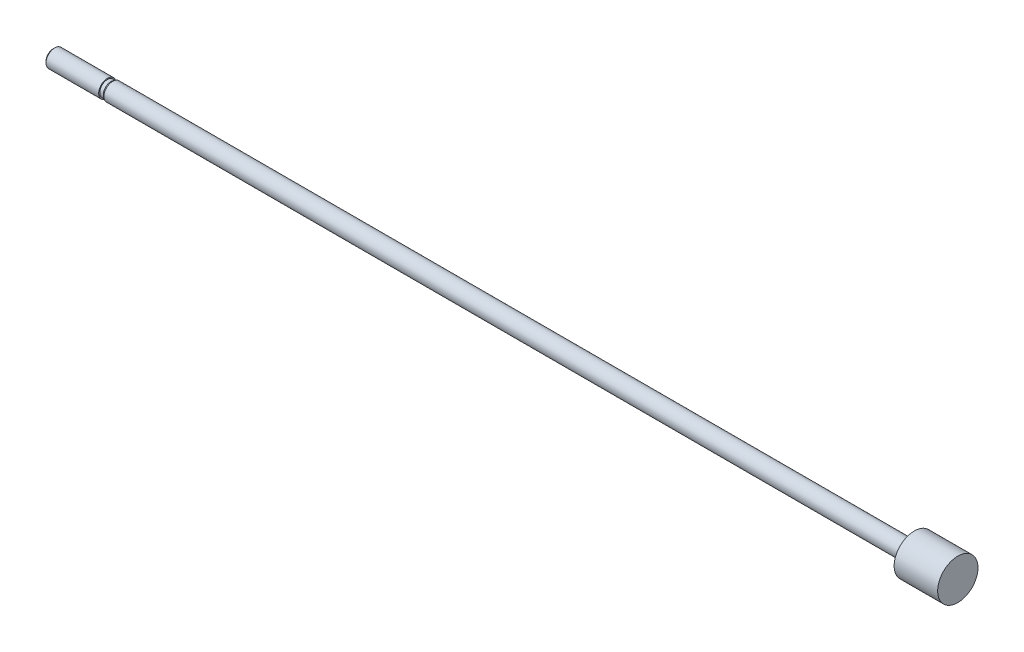
ISO-10303-21;
HEADER;
FILE_DESCRIPTION(('STEP AP214'),'2;1');
FILE_NAME('part.step','',(''),(''),'','','');
FILE_SCHEMA(('AUTOMOTIVE_DESIGN { 1 0 10303 214 1 1 1 1 }'));
ENDSEC;
DATA;
#1=APPLICATION_CONTEXT('core data for automotive mechanical design processes');
#2=APPLICATION_PROTOCOL_DEFINITION('international standard','automotive_design',2000,#1);
#3=PRODUCT_CONTEXT('',#1,'mechanical');
#4=PRODUCT('Part','Part','',(#3));
#5=PRODUCT_RELATED_PRODUCT_CATEGORY('part','',(#4));
#6=PRODUCT_DEFINITION_FORMATION('','',#4);
#7=PRODUCT_DEFINITION_CONTEXT('part definition',#1,'design');
#8=PRODUCT_DEFINITION('design','',#6,#7);
#9=PRODUCT_DEFINITION_SHAPE('','',#8);
#10=(LENGTH_UNIT() NAMED_UNIT(*) SI_UNIT(.MILLI.,.METRE.));
#11=(NAMED_UNIT(*) PLANE_ANGLE_UNIT() SI_UNIT($,.RADIAN.));
#12=(NAMED_UNIT(*) SI_UNIT($,.STERADIAN.) SOLID_ANGLE_UNIT());
#13=UNCERTAINTY_MEASURE_WITH_UNIT(LENGTH_MEASURE(1.E-05),#10,'distance_accuracy_value','');
#14=(GEOMETRIC_REPRESENTATION_CONTEXT(3) GLOBAL_UNCERTAINTY_ASSIGNED_CONTEXT((#13)) GLOBAL_UNIT_ASSIGNED_CONTEXT((#10,
#11,#12)) REPRESENTATION_CONTEXT('',''));
#15=CARTESIAN_POINT('',(0.,0.,0.));
#16=DIRECTION('',(0.,0.,1.));
#17=DIRECTION('',(1.,0.,0.));
#18=AXIS2_PLACEMENT_3D('',#15,#16,#17);
#19=CARTESIAN_POINT('',(0.,0.,0.));
#20=DIRECTION('',(1.,0.,0.));
#21=DIRECTION('',(0.,0.,-1.));
#22=AXIS2_PLACEMENT_3D('',#19,#20,#21);
#23=PLANE('',#22);
#24=CARTESIAN_POINT('',(0.,0.,0.));
#25=DIRECTION('',(1.,0.,0.));
#26=DIRECTION('',(0.,0.,-1.));
#27=AXIS2_PLACEMENT_3D('',#24,#25,#26);
#28=CIRCLE('',#27,2.0095);
#29=CARTESIAN_POINT('',(0.,0.,-2.0095));
#30=VERTEX_POINT('',#29);
#31=EDGE_CURVE('E47',#30,#30,#28,.T.);
#32=ORIENTED_EDGE('',*,*,#31,.F.);
#33=EDGE_LOOP('',(#32));
#34=FACE_BOUND('',#33,.T.);
#35=ADVANCED_FACE('F15',(#34),#23,.F.);
#36=CARTESIAN_POINT('',(0.,0.,0.));
#37=DIRECTION('',(1.,0.,0.));
#38=DIRECTION('',(0.,0.,-1.));
#39=AXIS2_PLACEMENT_3D('',#36,#37,#38);
#40=CONICAL_SURFACE('',#39,2.0095,0.785398163397443);
#41=CARTESIAN_POINT('',(0.490499999999997,0.,0.));
#42=DIRECTION('',(1.,0.,0.));
#43=DIRECTION('',(0.,0.,-1.));
#44=AXIS2_PLACEMENT_3D('',#41,#42,#43);
#45=CIRCLE('',#44,2.5);
#46=CARTESIAN_POINT('',(0.490499999999997,0.,-2.5));
#47=VERTEX_POINT('',#46);
#48=EDGE_CURVE('E44',#47,#47,#45,.T.);
#49=ORIENTED_EDGE('',*,*,#48,.F.);
#50=EDGE_LOOP('',(#49));
#51=FACE_BOUND('',#50,.T.);
#52=ORIENTED_EDGE('',*,*,#31,.T.);
#53=EDGE_LOOP('',(#52));
#54=FACE_BOUND('',#53,.T.);
#55=ADVANCED_FACE('F51',(#51,#54),#40,.T.);
#56=CARTESIAN_POINT('',(257.85,0.,0.));
#57=DIRECTION('',(1.,0.,0.));
#58=DIRECTION('',(0.,0.,-1.));
#59=AXIS2_PLACEMENT_3D('',#56,#57,#58);
#60=CYLINDRICAL_SURFACE('',#59,2.5);
#61=CARTESIAN_POINT('',(15.5,0.,0.));
#62=DIRECTION('',(1.,0.,0.));
#63=DIRECTION('',(0.,0.,-1.));
#64=AXIS2_PLACEMENT_3D('',#61,#62,#63);
#65=CIRCLE('',#64,2.5);
#66=CARTESIAN_POINT('',(15.5,0.,-2.5));
#67=VERTEX_POINT('',#66);
#68=EDGE_CURVE('E41',#67,#67,#65,.T.);
#69=ORIENTED_EDGE('',*,*,#68,.F.);
#70=EDGE_LOOP('',(#69));
#71=FACE_BOUND('',#70,.T.);
#72=ORIENTED_EDGE('',*,*,#48,.T.);
#73=EDGE_LOOP('',(#72));
#74=FACE_BOUND('',#73,.T.);
#75=ADVANCED_FACE('F59',(#71,#74),#60,.T.);
#76=CARTESIAN_POINT('',(15.5,2.5,0.));
#77=DIRECTION('',(-1.,0.,0.));
#78=DIRECTION('',(0.,0.,1.));
#79=AXIS2_PLACEMENT_3D('',#76,#77,#78);
#80=PLANE('',#79);
#81=CARTESIAN_POINT('',(15.5,0.,0.));
#82=DIRECTION('',(1.,0.,0.));
#83=DIRECTION('',(0.,0.,-1.));
#84=AXIS2_PLACEMENT_3D('',#81,#82,#83);
#85=CIRCLE('',#84,2.19);
#86=CARTESIAN_POINT('',(15.5,0.,-2.19));
#87=VERTEX_POINT('',#86);
#88=EDGE_CURVE('E38',#87,#87,#85,.T.);
#89=ORIENTED_EDGE('',*,*,#88,.F.);
#90=EDGE_LOOP('',(#89));
#91=FACE_BOUND('',#90,.T.);
#92=ORIENTED_EDGE('',*,*,#68,.T.);
#93=EDGE_LOOP('',(#92));
#94=FACE_BOUND('',#93,.T.);
#95=ADVANCED_FACE('F65',(#91,#94),#80,.F.);
#96=CARTESIAN_POINT('',(257.85,0.,0.));
#97=DIRECTION('',(1.,0.,0.));
#98=DIRECTION('',(0.,0.,-1.));
#99=AXIS2_PLACEMENT_3D('',#96,#97,#98);
#100=CYLINDRICAL_SURFACE('',#99,2.19);
#101=CARTESIAN_POINT('',(16.5,0.,0.));
#102=DIRECTION('',(1.,0.,0.));
#103=DIRECTION('',(0.,0.,-1.));
#104=AXIS2_PLACEMENT_3D('',#101,#102,#103);
#105=CIRCLE('',#104,2.19);
#106=CARTESIAN_POINT('',(16.5,0.,-2.19));
#107=VERTEX_POINT('',#106);
#108=EDGE_CURVE('E35',#107,#107,#105,.T.);
#109=ORIENTED_EDGE('',*,*,#108,.F.);
#110=EDGE_LOOP('',(#109));
#111=FACE_BOUND('',#110,.T.);
#112=ORIENTED_EDGE('',*,*,#88,.T.);
#113=EDGE_LOOP('',(#112));
#114=FACE_BOUND('',#113,.T.);
#115=ADVANCED_FACE('F69',(#111,#114),#100,.T.);
#116=CARTESIAN_POINT('',(16.5,0.,0.));
#117=DIRECTION('',(1.,0.,0.));
#118=DIRECTION('',(0.,0.,-1.));
#119=AXIS2_PLACEMENT_3D('',#116,#117,#118);
#120=CONICAL_SURFACE('',#119,2.19,0.554995727338586);
#121=CARTESIAN_POINT('',(17.,0.,0.));
#122=DIRECTION('',(1.,0.,0.));
#123=DIRECTION('',(0.,0.,-1.));
#124=AXIS2_PLACEMENT_3D('',#121,#122,#123);
#125=CIRCLE('',#124,2.5);
#126=CARTESIAN_POINT('',(17.,0.,-2.5));
#127=VERTEX_POINT('',#126);
#128=EDGE_CURVE('E30',#127,#127,#125,.T.);
#129=ORIENTED_EDGE('',*,*,#128,.F.);
#130=EDGE_LOOP('',(#129));
#131=FACE_BOUND('',#130,.T.);
#132=ORIENTED_EDGE('',*,*,#108,.T.);
#133=EDGE_LOOP('',(#132));
#134=FACE_BOUND('',#133,.T.);
#135=ADVANCED_FACE('F73',(#131,#134),#120,.T.);
#136=CARTESIAN_POINT('',(257.85,0.,0.));
#137=DIRECTION('',(1.,0.,0.));
#138=DIRECTION('',(0.,0.,-1.));
#139=AXIS2_PLACEMENT_3D('',#136,#137,#138);
#140=CYLINDRICAL_SURFACE('',#139,2.5);
#141=CARTESIAN_POINT('',(245.45,0.,0.));
#142=DIRECTION('',(1.,0.,0.));
#143=DIRECTION('',(0.,0.,-1.));
#144=AXIS2_PLACEMENT_3D('',#141,#142,#143);
#145=CIRCLE('',#144,2.5);
#146=CARTESIAN_POINT('',(245.45,0.,-2.5));
#147=VERTEX_POINT('',#146);
#148=EDGE_CURVE('E26',#147,#147,#145,.T.);
#149=ORIENTED_EDGE('',*,*,#148,.F.);
#150=EDGE_LOOP('',(#149));
#151=FACE_BOUND('',#150,.T.);
#152=ORIENTED_EDGE('',*,*,#128,.T.);
#153=EDGE_LOOP('',(#152));
#154=FACE_BOUND('',#153,.T.);
#155=ADVANCED_FACE('F77',(#151,#154),#140,.T.);
#156=CARTESIAN_POINT('',(245.45,2.5,0.));
#157=DIRECTION('',(1.,0.,0.));
#158=DIRECTION('',(0.,0.,-1.));
#159=AXIS2_PLACEMENT_3D('',#156,#157,#158);
#160=PLANE('',#159);
#161=CARTESIAN_POINT('',(245.45,0.,0.));
#162=DIRECTION('',(1.,0.,0.));
#163=DIRECTION('',(0.,0.,-1.));
#164=AXIS2_PLACEMENT_3D('',#161,#162,#163);
#165=CIRCLE('',#164,5.75);
#166=CARTESIAN_POINT('',(245.45,0.,-5.75));
#167=VERTEX_POINT('',#166);
#168=EDGE_CURVE('E22',#167,#167,#165,.T.);
#169=ORIENTED_EDGE('',*,*,#168,.F.);
#170=EDGE_LOOP('',(#169));
#171=FACE_BOUND('',#170,.T.);
#172=ORIENTED_EDGE('',*,*,#148,.T.);
#173=EDGE_LOOP('',(#172));
#174=FACE_BOUND('',#173,.T.);
#175=ADVANCED_FACE('F81',(#171,#174),#160,.F.);
#176=CARTESIAN_POINT('',(257.85,0.,0.));
#177=DIRECTION('',(1.,0.,0.));
#178=DIRECTION('',(0.,0.,-1.));
#179=AXIS2_PLACEMENT_3D('',#176,#177,#178);
#180=CYLINDRICAL_SURFACE('',#179,5.75);
#181=CARTESIAN_POINT('',(257.85,0.,0.));
#182=DIRECTION('',(1.,0.,0.));
#183=DIRECTION('',(0.,0.,-1.));
#184=AXIS2_PLACEMENT_3D('',#181,#182,#183);
#185=CIRCLE('',#184,5.75);
#186=CARTESIAN_POINT('',(257.85,0.,-5.75));
#187=VERTEX_POINT('',#186);
#188=EDGE_CURVE('E10',#187,#187,#185,.T.);
#189=ORIENTED_EDGE('',*,*,#188,.F.);
#190=EDGE_LOOP('',(#189));
#191=FACE_BOUND('',#190,.T.);
#192=ORIENTED_EDGE('',*,*,#168,.T.);
#193=EDGE_LOOP('',(#192));
#194=FACE_BOUND('',#193,.T.);
#195=ADVANCED_FACE('F84',(#191,#194),#180,.T.);
#196=CARTESIAN_POINT('',(257.85,5.75,0.));
#197=DIRECTION('',(-1.,0.,0.));
#198=DIRECTION('',(0.,0.,1.));
#199=AXIS2_PLACEMENT_3D('',#196,#197,#198);
#200=PLANE('',#199);
#201=ORIENTED_EDGE('',*,*,#188,.T.);
#202=EDGE_LOOP('',(#201));
#203=FACE_BOUND('',#202,.T.);
#204=ADVANCED_FACE('F17',(#203),#200,.F.);
#205=CLOSED_SHELL('',(#35,#55,#75,#95,#115,#135,#155,#175,#195,#204));
#206=MANIFOLD_SOLID_BREP('B1',#205);
#207=ADVANCED_BREP_SHAPE_REPRESENTATION('',(#18,#206),#14);
#208=SHAPE_DEFINITION_REPRESENTATION(#9,#207);
ENDSEC;
END-ISO-10303-21;
